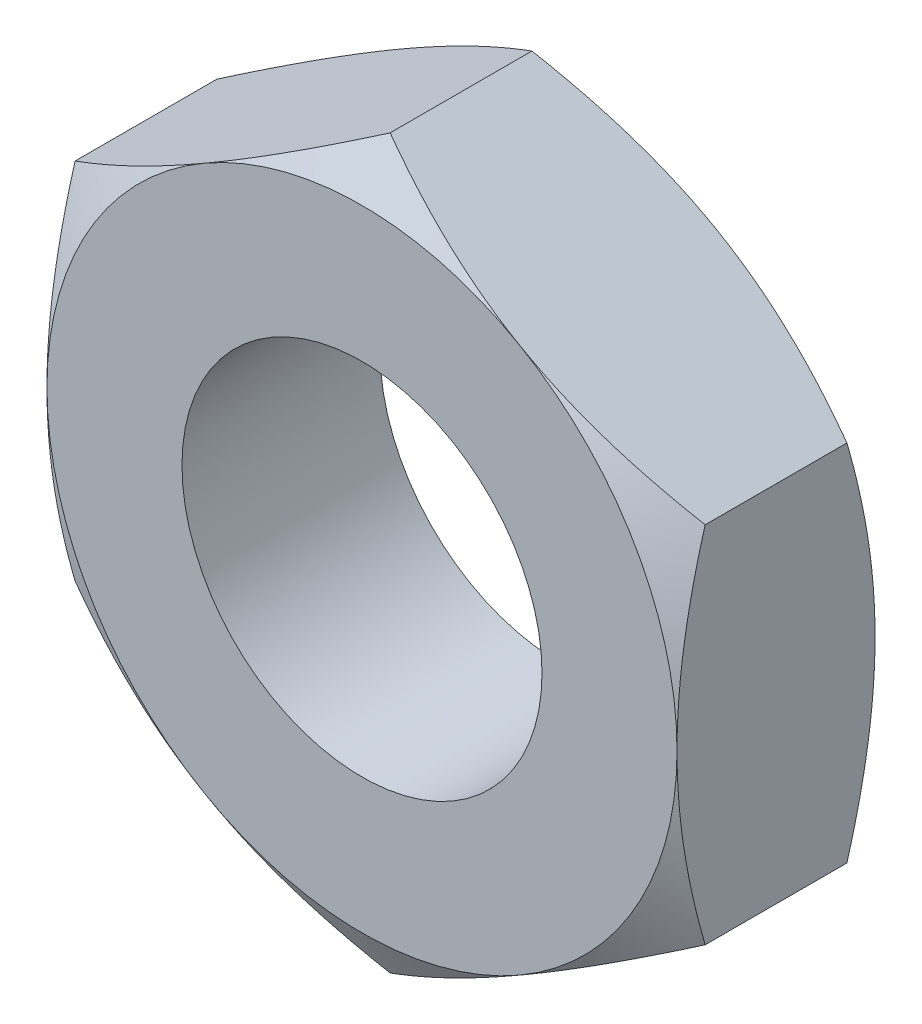
ISO-10303-21;
HEADER;
FILE_DESCRIPTION(('STEP AP214'),'2;1');
FILE_NAME('part.step','',(''),(''),'','','');
FILE_SCHEMA(('AUTOMOTIVE_DESIGN { 1 0 10303 214 1 1 1 1 }'));
ENDSEC;
DATA;
#1=APPLICATION_CONTEXT('core data for automotive mechanical design processes');
#2=APPLICATION_PROTOCOL_DEFINITION('international standard','automotive_design',2000,#1);
#3=PRODUCT_CONTEXT('',#1,'mechanical');
#4=PRODUCT('Part','Part','',(#3));
#5=PRODUCT_RELATED_PRODUCT_CATEGORY('part','',(#4));
#6=PRODUCT_DEFINITION_FORMATION('','',#4);
#7=PRODUCT_DEFINITION_CONTEXT('part definition',#1,'design');
#8=PRODUCT_DEFINITION('design','',#6,#7);
#9=PRODUCT_DEFINITION_SHAPE('','',#8);
#10=(LENGTH_UNIT() NAMED_UNIT(*) SI_UNIT(.MILLI.,.METRE.));
#11=(NAMED_UNIT(*) PLANE_ANGLE_UNIT() SI_UNIT($,.RADIAN.));
#12=(NAMED_UNIT(*) SI_UNIT($,.STERADIAN.) SOLID_ANGLE_UNIT());
#13=UNCERTAINTY_MEASURE_WITH_UNIT(LENGTH_MEASURE(1.E-05),#10,'distance_accuracy_value','');
#14=(GEOMETRIC_REPRESENTATION_CONTEXT(3) GLOBAL_UNCERTAINTY_ASSIGNED_CONTEXT((#13)) GLOBAL_UNIT_ASSIGNED_CONTEXT((#10,
#11,#12)) REPRESENTATION_CONTEXT('',''));
#15=CARTESIAN_POINT('',(0.,0.,0.));
#16=DIRECTION('',(0.,0.,1.));
#17=DIRECTION('',(1.,0.,0.));
#18=AXIS2_PLACEMENT_3D('',#15,#16,#17);
#19=CARTESIAN_POINT('',(0.,0.,-1.1));
#20=DIRECTION('',(0.,0.,1.));
#21=DIRECTION('',(1.,0.,0.));
#22=AXIS2_PLACEMENT_3D('',#19,#20,#21);
#23=PLANE('',#22);
#24=CARTESIAN_POINT('',(0.,0.,-1.1));
#25=DIRECTION('',(0.,0.,1.));
#26=DIRECTION('',(1.,0.,0.));
#27=AXIS2_PLACEMENT_3D('',#24,#25,#26);
#28=CIRCLE('',#27,2.);
#29=CARTESIAN_POINT('',(2.,0.,-1.1));
#30=VERTEX_POINT('',#29);
#31=EDGE_CURVE('E250',#30,#30,#28,.T.);
#32=ORIENTED_EDGE('',*,*,#31,.T.);
#33=EDGE_LOOP('',(#32));
#34=FACE_BOUND('',#33,.T.);
#35=CARTESIAN_POINT('',(0.,0.,-1.1));
#36=DIRECTION('',(0.,0.,1.));
#37=DIRECTION('',(1.,0.,0.));
#38=AXIS2_PLACEMENT_3D('',#35,#36,#37);
#39=CIRCLE('',#38,3.5);
#40=CARTESIAN_POINT('',(3.5,0.,-1.1));
#41=VERTEX_POINT('',#40);
#42=CARTESIAN_POINT('',(1.75,3.03108891324554,-1.1));
#43=VERTEX_POINT('',#42);
#44=EDGE_CURVE('E131',#41,#43,#39,.T.);
#45=ORIENTED_EDGE('',*,*,#44,.F.);
#46=CARTESIAN_POINT('',(0.,0.,-1.1));
#47=DIRECTION('',(0.,0.,1.));
#48=DIRECTION('',(1.,0.,0.));
#49=AXIS2_PLACEMENT_3D('',#46,#47,#48);
#50=CIRCLE('',#49,3.5);
#51=CARTESIAN_POINT('',(1.75,-3.03108891324553,-1.1));
#52=VERTEX_POINT('',#51);
#53=EDGE_CURVE('E12',#41,#52,#50,.F.);
#54=ORIENTED_EDGE('',*,*,#53,.T.);
#55=CARTESIAN_POINT('',(-1.75,-3.03108891324553,-1.1));
#56=VERTEX_POINT('',#55);
#57=EDGE_CURVE('E43',#52,#56,#50,.F.);
#58=ORIENTED_EDGE('',*,*,#57,.T.);
#59=CARTESIAN_POINT('',(-3.5,0.,-1.1));
#60=VERTEX_POINT('',#59);
#61=EDGE_CURVE('E309',#56,#60,#50,.F.);
#62=ORIENTED_EDGE('',*,*,#61,.T.);
#63=CARTESIAN_POINT('',(-1.75,3.03108891324553,-1.1));
#64=VERTEX_POINT('',#63);
#65=EDGE_CURVE('E143',#60,#64,#50,.F.);
#66=ORIENTED_EDGE('',*,*,#65,.T.);
#67=EDGE_CURVE('E44',#64,#43,#50,.F.);
#68=ORIENTED_EDGE('',*,*,#67,.T.);
#69=EDGE_LOOP('',(#45,#54,#58,#62,#66,#68));
#70=FACE_BOUND('',#69,.T.);
#71=ADVANCED_FACE('F34',(#34,#70),#23,.F.);
#72=CARTESIAN_POINT('',(0.,0.,1.1));
#73=DIRECTION('',(0.,0.,1.));
#74=DIRECTION('',(1.,0.,0.));
#75=AXIS2_PLACEMENT_3D('',#72,#73,#74);
#76=PLANE('',#75);
#77=CARTESIAN_POINT('',(0.,0.,1.1));
#78=DIRECTION('',(0.,0.,1.));
#79=DIRECTION('',(1.,0.,0.));
#80=AXIS2_PLACEMENT_3D('',#77,#78,#79);
#81=CIRCLE('',#80,2.);
#82=CARTESIAN_POINT('',(2.,0.,1.1));
#83=VERTEX_POINT('',#82);
#84=EDGE_CURVE('E246',#83,#83,#81,.T.);
#85=ORIENTED_EDGE('',*,*,#84,.F.);
#86=EDGE_LOOP('',(#85));
#87=FACE_BOUND('',#86,.T.);
#88=CARTESIAN_POINT('',(0.,0.,1.1));
#89=DIRECTION('',(0.,0.,1.));
#90=DIRECTION('',(1.,0.,0.));
#91=AXIS2_PLACEMENT_3D('',#88,#89,#90);
#92=CIRCLE('',#91,3.5);
#93=CARTESIAN_POINT('',(1.75,-3.03108891324553,1.1));
#94=VERTEX_POINT('',#93);
#95=CARTESIAN_POINT('',(3.5,0.,1.1));
#96=VERTEX_POINT('',#95);
#97=EDGE_CURVE('E291',#94,#96,#92,.T.);
#98=ORIENTED_EDGE('',*,*,#97,.T.);
#99=CARTESIAN_POINT('',(1.75,3.03108891324554,1.1));
#100=VERTEX_POINT('',#99);
#101=EDGE_CURVE('E280',#96,#100,#92,.T.);
#102=ORIENTED_EDGE('',*,*,#101,.T.);
#103=CARTESIAN_POINT('',(-1.75,3.03108891324553,1.1));
#104=VERTEX_POINT('',#103);
#105=EDGE_CURVE('E284',#100,#104,#92,.T.);
#106=ORIENTED_EDGE('',*,*,#105,.T.);
#107=CARTESIAN_POINT('',(-3.5,0.,1.1));
#108=VERTEX_POINT('',#107);
#109=EDGE_CURVE('E288',#104,#108,#92,.T.);
#110=ORIENTED_EDGE('',*,*,#109,.T.);
#111=CARTESIAN_POINT('',(-1.75,-3.03108891324554,1.1));
#112=VERTEX_POINT('',#111);
#113=EDGE_CURVE('E294',#108,#112,#92,.T.);
#114=ORIENTED_EDGE('',*,*,#113,.T.);
#115=EDGE_CURVE('E293',#112,#94,#92,.T.);
#116=ORIENTED_EDGE('',*,*,#115,.T.);
#117=EDGE_LOOP('',(#98,#102,#106,#110,#114,#116));
#118=FACE_BOUND('',#117,.T.);
#119=ADVANCED_FACE('F289',(#87,#118),#76,.T.);
#120=CARTESIAN_POINT('',(0.,4.04145188432738,1.1));
#121=DIRECTION('',(0.5,-0.866025403784438,0.));
#122=DIRECTION('',(0.866025403784439,0.5,0.));
#123=AXIS2_PLACEMENT_3D('',#120,#121,#122);
#124=PLANE('',#123);
#125=DIRECTION('',(0.,0.,-1.));
#126=VECTOR('',#125,1.);
#127=CARTESIAN_POINT('',(0.,4.04145188432738,1.1));
#128=LINE('',#127,#126);
#129=CARTESIAN_POINT('',(0.,4.04145188432738,0.787392608830358));
#130=VERTEX_POINT('',#129);
#131=CARTESIAN_POINT('',(0.,4.04145188432738,-0.787392608830359));
#132=VERTEX_POINT('',#131);
#133=EDGE_CURVE('E249',#130,#132,#128,.T.);
#134=ORIENTED_EDGE('',*,*,#133,.T.);
#135=CARTESIAN_POINT('',(0.000200000000002078,4.04156735438122,-0.787325939306631));
#136=CARTESIAN_POINT('',(-0.153607178452448,3.9527667384984,-0.838614211010018));
#137=CARTESIAN_POINT('',(-0.308742010834422,3.86319960126198,-0.885259046183804));
#138=CARTESIAN_POINT('',(-0.621698006576779,3.68251437287562,-0.966678124466652));
#139=CARTESIAN_POINT('',(-0.779524730787493,3.59139307116725,-1.00142356441544));
#140=CARTESIAN_POINT('',(-1.09322221038012,3.41027974688034,-1.05550997281717));
#141=CARTESIAN_POINT('',(-1.24904469916069,3.32031559103708,-1.07521091373962));
#142=CARTESIAN_POINT('',(-1.56142288720537,3.13996396008052,-1.09872986726275));
#143=CARTESIAN_POINT('',(-1.71797745103423,3.04957714051106,-1.10256735545444));
#144=CARTESIAN_POINT('',(-2.01050921992099,2.88068384499777,-1.09458469812302));
#145=CARTESIAN_POINT('',(-2.1465302124579,2.80215208834114,-1.08472456593039));
#146=CARTESIAN_POINT('',(-2.41768602028899,2.64560020969753,-1.0534735331006));
#147=CARTESIAN_POINT('',(-2.55281989768468,2.56758062920649,-1.0320719567142));
#148=CARTESIAN_POINT('',(-2.82453479240518,2.41070596159678,-0.978569592119425));
#149=CARTESIAN_POINT('',(-2.96108141927834,2.33187072981463,-0.946242005554915));
#150=CARTESIAN_POINT('',(-3.2321380929445,2.17537608630783,-0.872871066192007));
#151=CARTESIAN_POINT('',(-3.36665161246854,2.09771466960098,-0.831844953430135));
#152=CARTESIAN_POINT('',(-3.5002,2.02061047210985,-0.787325939306631));
#153=B_SPLINE_CURVE_WITH_KNOTS('',3,(#135,#136,#137,#138,#139,#140,#141,#142,#143,#144,#145,
#146,#147,#148,#149,#150,#151,#152),.UNSPECIFIED.,.F.,.F.,(4,2,2,2,2,2,2,2,4),(0.,
0.554793832886254,1.11092123814984,1.65328467083219,2.19498204478403,2.6666513085086,
3.13875761298267,3.6213361260051,4.10296698719188),.UNSPECIFIED.);
#154=EDGE_CURVE('E57',#132,#64,#153,.T.);
#155=ORIENTED_EDGE('',*,*,#154,.T.);
#156=CARTESIAN_POINT('',(-3.5,2.02072594216369,-0.787392608830358));
#157=VERTEX_POINT('',#156);
#158=EDGE_CURVE('E176',#64,#157,#153,.T.);
#159=ORIENTED_EDGE('',*,*,#158,.T.);
#160=DIRECTION('',(0.,0.,-1.));
#161=VECTOR('',#160,1.);
#162=CARTESIAN_POINT('',(-3.5,2.02072594216369,1.1));
#163=LINE('',#162,#161);
#164=CARTESIAN_POINT('',(-3.5,2.02072594216369,0.787392608830358));
#165=VERTEX_POINT('',#164);
#166=EDGE_CURVE('E264',#165,#157,#163,.T.);
#167=ORIENTED_EDGE('',*,*,#166,.F.);
#168=CARTESIAN_POINT('',(0.000200000000002078,4.04156735438122,0.787325939306631));
#169=CARTESIAN_POINT('',(-0.153607178452448,3.9527667384984,0.838614211010018));
#170=CARTESIAN_POINT('',(-0.308742010834422,3.86319960126198,0.885259046183804));
#171=CARTESIAN_POINT('',(-0.621698006576779,3.68251437287562,0.966678124466652));
#172=CARTESIAN_POINT('',(-0.779524730787493,3.59139307116725,1.00142356441544));
#173=CARTESIAN_POINT('',(-1.09322221038012,3.41027974688034,1.05550997281717));
#174=CARTESIAN_POINT('',(-1.24904469916069,3.32031559103708,1.07521091373962));
#175=CARTESIAN_POINT('',(-1.56142288720537,3.13996396008052,1.09872986726275));
#176=CARTESIAN_POINT('',(-1.71797745103423,3.04957714051106,1.10256735545444));
#177=CARTESIAN_POINT('',(-2.01050921992099,2.88068384499777,1.09458469812302));
#178=CARTESIAN_POINT('',(-2.1465302124579,2.80215208834114,1.08472456593039));
#179=CARTESIAN_POINT('',(-2.41768602028899,2.64560020969753,1.0534735331006));
#180=CARTESIAN_POINT('',(-2.55281989768468,2.56758062920649,1.0320719567142));
#181=CARTESIAN_POINT('',(-2.82453479240518,2.41070596159678,0.978569592119425));
#182=CARTESIAN_POINT('',(-2.96108141927834,2.33187072981463,0.946242005554915));
#183=CARTESIAN_POINT('',(-3.2321380929445,2.17537608630783,0.872871066192007));
#184=CARTESIAN_POINT('',(-3.36665161246854,2.09771466960098,0.831844953430135));
#185=CARTESIAN_POINT('',(-3.5002,2.02061047210985,0.787325939306631));
#186=B_SPLINE_CURVE_WITH_KNOTS('',3,(#168,#169,#170,#171,#172,#173,#174,#175,#176,#177,#178,
#179,#180,#181,#182,#183,#184,#185),.UNSPECIFIED.,.F.,.F.,(4,2,2,2,2,2,2,2,4),(0.,
0.554793832886254,1.11092123814984,1.65328467083219,2.19498204478403,2.6666513085086,
3.13875761298267,3.6213361260051,4.10296698719188),.UNSPECIFIED.);
#187=EDGE_CURVE('E239',#104,#165,#186,.T.);
#188=ORIENTED_EDGE('',*,*,#187,.F.);
#189=EDGE_CURVE('E245',#130,#104,#186,.T.);
#190=ORIENTED_EDGE('',*,*,#189,.F.);
#191=EDGE_LOOP('',(#134,#155,#159,#167,#188,#190));
#192=FACE_BOUND('',#191,.T.);
#193=ADVANCED_FACE('F36',(#192),#124,.F.);
#194=CARTESIAN_POINT('',(-3.5,2.02072594216369,1.1));
#195=DIRECTION('',(1.,0.,0.));
#196=DIRECTION('',(0.,0.,-1.));
#197=AXIS2_PLACEMENT_3D('',#194,#195,#196);
#198=PLANE('',#197);
#199=ORIENTED_EDGE('',*,*,#166,.T.);
#200=CARTESIAN_POINT('',(-3.5,6.62237498929366,1.20384920069994));
#201=CARTESIAN_POINT('',(-3.5,6.46698337506326,1.12454141631422));
#202=CARTESIAN_POINT('',(-3.5,6.31135185717237,1.04569935323296));
#203=CARTESIAN_POINT('',(-3.5,5.99950103907308,0.889178400037028));
#204=CARTESIAN_POINT('',(-3.5,5.84328172590165,0.811499535765534));
#205=CARTESIAN_POINT('',(-3.5,5.5298815671078,0.657406187731065));
#206=CARTESIAN_POINT('',(-3.5,5.37269952074963,0.580994141518542));
#207=CARTESIAN_POINT('',(-3.5,5.05750606530903,0.429891265605384));
#208=CARTESIAN_POINT('',(-3.5,4.89949464406857,0.355200461223919));
#209=CARTESIAN_POINT('',(-3.5,4.57449132742173,0.204239431299977));
#210=CARTESIAN_POINT('',(-3.5,4.40744814542194,0.128079290995464));
#211=CARTESIAN_POINT('',(-3.5,4.07203575670421,-0.0212598293516295));
#212=CARTESIAN_POINT('',(-3.5,3.90366658905408,-0.0944388968370185));
#213=CARTESIAN_POINT('',(-3.5,3.56542884332594,-0.236925943955217));
#214=CARTESIAN_POINT('',(-3.5,3.39556140883553,-0.30623662244884));
#215=CARTESIAN_POINT('',(-3.5,3.05383707796127,-0.439922098926701));
#216=CARTESIAN_POINT('',(-3.5,2.88197969950816,-0.504295670818577));
#217=CARTESIAN_POINT('',(-3.5,2.50410670294663,-0.637833379820852));
#218=CARTESIAN_POINT('',(-3.5,2.297624628782,-0.705699382529659));
#219=CARTESIAN_POINT('',(-3.5,1.88102985453117,-0.828978898262891));
#220=CARTESIAN_POINT('',(-3.5,1.67091915944462,-0.884399065240015));
#221=CARTESIAN_POINT('',(-3.5,1.25075240656588,-0.977701848207576));
#222=CARTESIAN_POINT('',(-3.5,1.04076681074656,-1.01588906183022));
#223=CARTESIAN_POINT('',(-3.5,0.723839080925787,-1.05809544723149));
#224=CARTESIAN_POINT('',(-3.5,0.61788035843607,-1.06965150772116));
#225=CARTESIAN_POINT('',(-3.5,0.4055193253992,-1.08738499992973));
#226=CARTESIAN_POINT('',(-3.5,0.299117080850263,-1.09356320507411));
#227=CARTESIAN_POINT('',(-3.5,0.0849448337999638,-1.10035848122527));
#228=CARTESIAN_POINT('',(-3.5,-0.0228271767806619,-1.1009126969313));
#229=CARTESIAN_POINT('',(-3.5,-0.238246571061905,-1.09627742939031));
#230=CARTESIAN_POINT('',(-3.5,-0.345893954242542,-1.09108792226466));
#231=CARTESIAN_POINT('',(-3.5,-0.560802179242902,-1.07515035334444));
#232=CARTESIAN_POINT('',(-3.5,-0.668062908780274,-1.06440079026023));
#233=CARTESIAN_POINT('',(-3.5,-0.881942140476983,-1.03770671567076));
#234=CARTESIAN_POINT('',(-3.5,-0.988560539769251,-1.02176139348268));
#235=CARTESIAN_POINT('',(-3.5,-1.31125051597137,-0.966139132186342));
#236=CARTESIAN_POINT('',(-3.5,-1.52605146710536,-0.919009608816308));
#237=CARTESIAN_POINT('',(-3.5,-1.95168495091537,-0.809695494576592));
#238=CARTESIAN_POINT('',(-3.5,-2.16251665140647,-0.747507783701123));
#239=CARTESIAN_POINT('',(-3.5,-2.56094887059657,-0.618466181316136));
#240=CARTESIAN_POINT('',(-3.5,-2.74887345130752,-0.55259716518923));
#241=CARTESIAN_POINT('',(-3.5,-3.12222177135753,-0.414079554638817));
#242=CARTESIAN_POINT('',(-3.5,-3.30764504196638,-0.341429709186368));
#243=CARTESIAN_POINT('',(-3.5,-3.67657256285478,-0.190985608211726));
#244=CARTESIAN_POINT('',(-3.5,-3.86007493353262,-0.113186776469622));
#245=CARTESIAN_POINT('',(-3.5,-4.22537274809097,0.0462649474191521));
#246=CARTESIAN_POINT('',(-3.5,-4.40716831978745,0.127917548166092));
#247=CARTESIAN_POINT('',(-3.5,-4.75995065416868,0.289860655115455));
#248=CARTESIAN_POINT('',(-3.5,-4.9310069133884,0.370000334369653));
#249=CARTESIAN_POINT('',(-3.5,-5.27211537161897,0.532396052430232));
#250=CARTESIAN_POINT('',(-3.5,-5.44216754365314,0.614652147782862));
#251=CARTESIAN_POINT('',(-3.5,-5.78097533377333,0.78062598575474));
#252=CARTESIAN_POINT('',(-3.5,-5.94973323172869,0.864339084844612));
#253=CARTESIAN_POINT('',(-3.5,-6.28654510508321,1.0331382707255));
#254=CARTESIAN_POINT('',(-3.5,-6.45459913401863,1.11822425061562));
#255=CARTESIAN_POINT('',(-3.5,-6.62237498929366,1.20384920069994));
#256=B_SPLINE_CURVE_WITH_KNOTS('',3,(#200,#201,#202,#203,#204,#205,#206,#207,#208,#209,#210,
#211,#212,#213,#214,#215,#216,#217,#218,#219,#220,#221,#222,#223,#224,#225,#226,#227,#228,#229,
#230,#231,#232,#233,#234,#235,#236,#237,#238,#239,#240,#241,#242,#243,#244,#245,#246,#247,#248,
#249,#250,#251,#252,#253,#254,#255),.UNSPECIFIED.,.F.,.F.,(4,2,2,2,2,2,2,2,2,2,2,2,2,2,2,2,2,2,
2,2,2,2,2,2,2,2,2,4),(0.,0.523382036157963,1.04677568326574,1.57108083596182,2.09539369617973,
2.64612852875721,3.19684719516559,3.74717671101212,4.29764245735546,4.949398757836,
5.60080577401626,6.24019874636632,6.55984296489709,6.87944120564918,7.20260748486242,
7.52577510759325,7.84903003550124,8.17233542433221,8.83125396706322,9.49030915249859,
10.0875436381509,10.6848885291939,11.2827716379512,11.8806096104473,12.4472873912146,
13.0139803281913,13.5791142859313,14.1442044492399),.UNSPECIFIED.);
#257=EDGE_CURVE('E297',#157,#60,#256,.T.);
#258=ORIENTED_EDGE('',*,*,#257,.T.);
#259=CARTESIAN_POINT('',(-3.5,-2.02072594216369,-0.787392608830357));
#260=VERTEX_POINT('',#259);
#261=EDGE_CURVE('E202',#60,#260,#256,.T.);
#262=ORIENTED_EDGE('',*,*,#261,.T.);
#263=DIRECTION('',(0.,0.,-1.));
#264=VECTOR('',#263,1.);
#265=CARTESIAN_POINT('',(-3.5,-2.02072594216369,1.1));
#266=LINE('',#265,#264);
#267=CARTESIAN_POINT('',(-3.5,-2.02072594216369,0.787392608830357));
#268=VERTEX_POINT('',#267);
#269=EDGE_CURVE('E261',#268,#260,#266,.T.);
#270=ORIENTED_EDGE('',*,*,#269,.F.);
#271=CARTESIAN_POINT('',(-3.5,6.62237498929366,-1.20384920069994));
#272=CARTESIAN_POINT('',(-3.5,6.46698337506326,-1.12454141631422));
#273=CARTESIAN_POINT('',(-3.5,6.31135185717237,-1.04569935323296));
#274=CARTESIAN_POINT('',(-3.5,5.99950103907308,-0.889178400037028));
#275=CARTESIAN_POINT('',(-3.5,5.84328172590165,-0.811499535765535));
#276=CARTESIAN_POINT('',(-3.5,5.5298815671078,-0.657406187731066));
#277=CARTESIAN_POINT('',(-3.5,5.37269952074963,-0.580994141518543));
#278=CARTESIAN_POINT('',(-3.5,5.05750606530903,-0.429891265605384));
#279=CARTESIAN_POINT('',(-3.5,4.89949464406857,-0.355200461223919));
#280=CARTESIAN_POINT('',(-3.5,4.57449132742173,-0.204239431299977));
#281=CARTESIAN_POINT('',(-3.5,4.40744814542195,-0.128079290995465));
#282=CARTESIAN_POINT('',(-3.5,4.07203575670421,0.021259829351629));
#283=CARTESIAN_POINT('',(-3.5,3.90366658905408,0.0944388968370181));
#284=CARTESIAN_POINT('',(-3.5,3.56542884332594,0.236925943955217));
#285=CARTESIAN_POINT('',(-3.5,3.39556140883553,0.30623662244884));
#286=CARTESIAN_POINT('',(-3.5,3.05383707796127,0.439922098926701));
#287=CARTESIAN_POINT('',(-3.5,2.88197969950816,0.504295670818577));
#288=CARTESIAN_POINT('',(-3.5,2.50410670294663,0.637833379820852));
#289=CARTESIAN_POINT('',(-3.5,2.297624628782,0.705699382529659));
#290=CARTESIAN_POINT('',(-3.5,1.88102985453117,0.828978898262891));
#291=CARTESIAN_POINT('',(-3.5,1.67091915944462,0.884399065240015));
#292=CARTESIAN_POINT('',(-3.5,1.25075240656588,0.977701848207575));
#293=CARTESIAN_POINT('',(-3.5,1.04076681074657,1.01588906183022));
#294=CARTESIAN_POINT('',(-3.5,0.72383908092579,1.05809544723149));
#295=CARTESIAN_POINT('',(-3.5,0.617880358436072,1.06965150772116));
#296=CARTESIAN_POINT('',(-3.5,0.405519325399202,1.08738499992973));
#297=CARTESIAN_POINT('',(-3.5,0.299117080850265,1.09356320507411));
#298=CARTESIAN_POINT('',(-3.5,0.0849448337999658,1.10035848122527));
#299=CARTESIAN_POINT('',(-3.5,-0.0228271767806601,1.1009126969313));
#300=CARTESIAN_POINT('',(-3.5,-0.238246571061904,1.09627742939031));
#301=CARTESIAN_POINT('',(-3.5,-0.345893954242541,1.09108792226466));
#302=CARTESIAN_POINT('',(-3.5,-0.560802179242901,1.07515035334444));
#303=CARTESIAN_POINT('',(-3.5,-0.668062908780272,1.06440079026023));
#304=CARTESIAN_POINT('',(-3.5,-0.881942140476982,1.03770671567076));
#305=CARTESIAN_POINT('',(-3.5,-0.98856053976925,1.02176139348268));
#306=CARTESIAN_POINT('',(-3.5,-1.31125051597137,0.966139132186342));
#307=CARTESIAN_POINT('',(-3.5,-1.52605146710536,0.919009608816308));
#308=CARTESIAN_POINT('',(-3.5,-1.95168495091536,0.809695494576593));
#309=CARTESIAN_POINT('',(-3.5,-2.16251665140647,0.747507783701123));
#310=CARTESIAN_POINT('',(-3.5,-2.56094887059657,0.618466181316137));
#311=CARTESIAN_POINT('',(-3.5,-2.74887345130752,0.55259716518923));
#312=CARTESIAN_POINT('',(-3.5,-3.12222177135753,0.414079554638817));
#313=CARTESIAN_POINT('',(-3.5,-3.30764504196638,0.341429709186368));
#314=CARTESIAN_POINT('',(-3.5,-3.67657256285478,0.190985608211727));
#315=CARTESIAN_POINT('',(-3.5,-3.86007493353262,0.113186776469622));
#316=CARTESIAN_POINT('',(-3.5,-4.22537274809097,-0.0462649474191521));
#317=CARTESIAN_POINT('',(-3.5,-4.40716831978745,-0.127917548166092));
#318=CARTESIAN_POINT('',(-3.5,-4.75995065416868,-0.289860655115455));
#319=CARTESIAN_POINT('',(-3.5,-4.9310069133884,-0.370000334369654));
#320=CARTESIAN_POINT('',(-3.5,-5.27211537161897,-0.532396052430233));
#321=CARTESIAN_POINT('',(-3.5,-5.44216754365314,-0.614652147782862));
#322=CARTESIAN_POINT('',(-3.5,-5.78097533377333,-0.780625985754741));
#323=CARTESIAN_POINT('',(-3.5,-5.94973323172869,-0.864339084844613));
#324=CARTESIAN_POINT('',(-3.5,-6.28654510508321,-1.0331382707255));
#325=CARTESIAN_POINT('',(-3.5,-6.45459913401863,-1.11822425061563));
#326=CARTESIAN_POINT('',(-3.5,-6.62237498929366,-1.20384920069994));
#327=B_SPLINE_CURVE_WITH_KNOTS('',3,(#271,#272,#273,#274,#275,#276,#277,#278,#279,#280,#281,
#282,#283,#284,#285,#286,#287,#288,#289,#290,#291,#292,#293,#294,#295,#296,#297,#298,#299,#300,
#301,#302,#303,#304,#305,#306,#307,#308,#309,#310,#311,#312,#313,#314,#315,#316,#317,#318,#319,
#320,#321,#322,#323,#324,#325,#326),.UNSPECIFIED.,.F.,.F.,(4,2,2,2,2,2,2,2,2,2,2,2,2,2,2,2,2,2,
2,2,2,2,2,2,2,2,2,4),(0.,0.523382036157963,1.04677568326574,1.57108083596182,2.09539369617973,
2.64612852875721,3.19684719516559,3.74717671101212,4.29764245735546,4.949398757836,
5.60080577401626,6.24019874636632,6.55984296489708,6.87944120564917,7.20260748486242,
7.52577510759325,7.84903003550124,8.17233542433221,8.83125396706322,9.49030915249859,
10.0875436381509,10.6848885291939,11.2827716379512,11.8806096104473,12.4472873912146,
13.0139803281913,13.5791142859313,14.1442044492399),.UNSPECIFIED.);
#328=EDGE_CURVE('E232',#108,#268,#327,.T.);
#329=ORIENTED_EDGE('',*,*,#328,.F.);
#330=EDGE_CURVE('E238',#165,#108,#327,.T.);
#331=ORIENTED_EDGE('',*,*,#330,.F.);
#332=EDGE_LOOP('',(#199,#258,#262,#270,#329,#331));
#333=FACE_BOUND('',#332,.T.);
#334=ADVANCED_FACE('F211',(#333),#198,.F.);
#335=CARTESIAN_POINT('',(-3.5,-2.02072594216369,1.1));
#336=DIRECTION('',(0.5,0.866025403784438,0.));
#337=DIRECTION('',(-0.866025403784439,0.5,0.));
#338=AXIS2_PLACEMENT_3D('',#335,#336,#337);
#339=PLANE('',#338);
#340=ORIENTED_EDGE('',*,*,#269,.T.);
#341=CARTESIAN_POINT('',(-3.5002,-2.02061047210985,-0.787325939306629));
#342=CARTESIAN_POINT('',(-3.34639282154755,-2.10941108799267,-0.838614211010017));
#343=CARTESIAN_POINT('',(-3.19125798916558,-2.19897822522909,-0.885259046183803));
#344=CARTESIAN_POINT('',(-2.87830199342322,-2.37966345361545,-0.966678124466651));
#345=CARTESIAN_POINT('',(-2.72047526921251,-2.47078475532382,-1.00142356441544));
#346=CARTESIAN_POINT('',(-2.40677778961987,-2.65189807961074,-1.05550997281716));
#347=CARTESIAN_POINT('',(-2.25095530083931,-2.74186223545399,-1.07521091373962));
#348=CARTESIAN_POINT('',(-1.93857711279463,-2.92221386641056,-1.09872986726274));
#349=CARTESIAN_POINT('',(-1.78202254896577,-3.01260068598001,-1.10256735545443));
#350=CARTESIAN_POINT('',(-1.48949078007901,-3.1814939814933,-1.09458469812302));
#351=CARTESIAN_POINT('',(-1.3534697875421,-3.26002573814993,-1.08472456593039));
#352=CARTESIAN_POINT('',(-1.08231397971101,-3.41657761679354,-1.0534735331006));
#353=CARTESIAN_POINT('',(-0.947180102315319,-3.49459719728458,-1.0320719567142));
#354=CARTESIAN_POINT('',(-0.675465207594818,-3.65147186489429,-0.978569592119422));
#355=CARTESIAN_POINT('',(-0.538918580721667,-3.73030709667644,-0.946242005554913));
#356=CARTESIAN_POINT('',(-0.2678619070555,-3.88680174018324,-0.872871066192006));
#357=CARTESIAN_POINT('',(-0.133348387531465,-3.96446315689009,-0.831844953430134));
#358=CARTESIAN_POINT('',(0.000199999999997778,-4.04156735438122,-0.78732593930663));
#359=B_SPLINE_CURVE_WITH_KNOTS('',3,(#341,#342,#343,#344,#345,#346,#347,#348,#349,#350,#351,
#352,#353,#354,#355,#356,#357,#358),.UNSPECIFIED.,.F.,.F.,(4,2,2,2,2,2,2,2,4),(0.,
0.554793832886254,1.11092123814984,1.65328467083219,2.19498204478403,2.6666513085086,
3.13875761298267,3.6213361260051,4.10296698719187),.UNSPECIFIED.);
#360=EDGE_CURVE('E200',#260,#56,#359,.T.);
#361=ORIENTED_EDGE('',*,*,#360,.T.);
#362=CARTESIAN_POINT('',(0.,-4.04145188432738,-0.787392608830357));
#363=VERTEX_POINT('',#362);
#364=EDGE_CURVE('E193',#56,#363,#359,.T.);
#365=ORIENTED_EDGE('',*,*,#364,.T.);
#366=DIRECTION('',(0.,0.,-1.));
#367=VECTOR('',#366,1.);
#368=CARTESIAN_POINT('',(0.,-4.04145188432738,1.1));
#369=LINE('',#368,#367);
#370=CARTESIAN_POINT('',(0.,-4.04145188432738,0.787392608830357));
#371=VERTEX_POINT('',#370);
#372=EDGE_CURVE('E258',#371,#363,#369,.T.);
#373=ORIENTED_EDGE('',*,*,#372,.F.);
#374=CARTESIAN_POINT('',(-3.5002,-2.02061047210985,0.787325939306629));
#375=CARTESIAN_POINT('',(-3.34639282154755,-2.10941108799267,0.838614211010017));
#376=CARTESIAN_POINT('',(-3.19125798916558,-2.19897822522909,0.885259046183803));
#377=CARTESIAN_POINT('',(-2.87830199342322,-2.37966345361545,0.966678124466651));
#378=CARTESIAN_POINT('',(-2.72047526921251,-2.47078475532382,1.00142356441544));
#379=CARTESIAN_POINT('',(-2.40677778961987,-2.65189807961074,1.05550997281716));
#380=CARTESIAN_POINT('',(-2.25095530083931,-2.74186223545399,1.07521091373962));
#381=CARTESIAN_POINT('',(-1.93857711279463,-2.92221386641056,1.09872986726274));
#382=CARTESIAN_POINT('',(-1.78202254896577,-3.01260068598001,1.10256735545443));
#383=CARTESIAN_POINT('',(-1.48949078007901,-3.1814939814933,1.09458469812302));
#384=CARTESIAN_POINT('',(-1.3534697875421,-3.26002573814993,1.08472456593039));
#385=CARTESIAN_POINT('',(-1.08231397971101,-3.41657761679354,1.0534735331006));
#386=CARTESIAN_POINT('',(-0.947180102315319,-3.49459719728458,1.0320719567142));
#387=CARTESIAN_POINT('',(-0.675465207594818,-3.65147186489429,0.978569592119422));
#388=CARTESIAN_POINT('',(-0.538918580721667,-3.73030709667644,0.946242005554913));
#389=CARTESIAN_POINT('',(-0.2678619070555,-3.88680174018324,0.872871066192006));
#390=CARTESIAN_POINT('',(-0.133348387531465,-3.96446315689009,0.831844953430134));
#391=CARTESIAN_POINT('',(0.000199999999997778,-4.04156735438122,0.78732593930663));
#392=B_SPLINE_CURVE_WITH_KNOTS('',3,(#374,#375,#376,#377,#378,#379,#380,#381,#382,#383,#384,
#385,#386,#387,#388,#389,#390,#391),.UNSPECIFIED.,.F.,.F.,(4,2,2,2,2,2,2,2,4),(0.,
0.554793832886254,1.11092123814984,1.65328467083219,2.19498204478403,2.6666513085086,
3.13875761298267,3.6213361260051,4.10296698719187),.UNSPECIFIED.);
#393=EDGE_CURVE('E217',#112,#371,#392,.T.);
#394=ORIENTED_EDGE('',*,*,#393,.F.);
#395=EDGE_CURVE('E224',#268,#112,#392,.T.);
#396=ORIENTED_EDGE('',*,*,#395,.F.);
#397=EDGE_LOOP('',(#340,#361,#365,#373,#394,#396));
#398=FACE_BOUND('',#397,.T.);
#399=ADVANCED_FACE('F207',(#398),#339,.F.);
#400=CARTESIAN_POINT('',(0.,-4.04145188432738,1.1));
#401=DIRECTION('',(-0.5,0.866025403784438,0.));
#402=DIRECTION('',(-0.866025403784438,-0.5,0.));
#403=AXIS2_PLACEMENT_3D('',#400,#401,#402);
#404=PLANE('',#403);
#405=ORIENTED_EDGE('',*,*,#372,.T.);
#406=CARTESIAN_POINT('',(-0.000200000000001753,-4.04156735438122,-0.787325939306629));
#407=CARTESIAN_POINT('',(0.153607178452448,-3.9527667384984,-0.838614211010017));
#408=CARTESIAN_POINT('',(0.308742010834422,-3.86319960126198,-0.885259046183803));
#409=CARTESIAN_POINT('',(0.62169800657678,-3.68251437287562,-0.966678124466652));
#410=CARTESIAN_POINT('',(0.779524730787494,-3.59139307116725,-1.00142356441544));
#411=CARTESIAN_POINT('',(1.09322221038013,-3.41027974688034,-1.05550997281716));
#412=CARTESIAN_POINT('',(1.24904469916069,-3.32031559103708,-1.07521091373962));
#413=CARTESIAN_POINT('',(1.56142288720537,-3.13996396008052,-1.09872986726275));
#414=CARTESIAN_POINT('',(1.71797745103423,-3.04957714051106,-1.10256735545444));
#415=CARTESIAN_POINT('',(2.01050921992099,-2.88068384499777,-1.09458469812302));
#416=CARTESIAN_POINT('',(2.1465302124579,-2.80215208834114,-1.08472456593039));
#417=CARTESIAN_POINT('',(2.41768602028899,-2.64560020969753,-1.0534735331006));
#418=CARTESIAN_POINT('',(2.55281989768468,-2.5675806292065,-1.0320719567142));
#419=CARTESIAN_POINT('',(2.82453479240518,-2.41070596159678,-0.978569592119424));
#420=CARTESIAN_POINT('',(2.96108141927833,-2.33187072981463,-0.946242005554915));
#421=CARTESIAN_POINT('',(3.2321380929445,-2.17537608630783,-0.872871066192008));
#422=CARTESIAN_POINT('',(3.36665161246853,-2.09771466960098,-0.831844953430135));
#423=CARTESIAN_POINT('',(3.5002,-2.02061047210985,-0.787325939306632));
#424=B_SPLINE_CURVE_WITH_KNOTS('',3,(#406,#407,#408,#409,#410,#411,#412,#413,#414,#415,#416,
#417,#418,#419,#420,#421,#422,#423),.UNSPECIFIED.,.F.,.F.,(4,2,2,2,2,2,2,2,4),(0.,
0.554793832886254,1.11092123814984,1.65328467083219,2.19498204478403,2.6666513085086,
3.13875761298267,3.6213361260051,4.10296698719187),.UNSPECIFIED.);
#425=EDGE_CURVE('E201',#363,#52,#424,.T.);
#426=ORIENTED_EDGE('',*,*,#425,.T.);
#427=CARTESIAN_POINT('',(3.5,-2.02072594216369,-0.787392608830359));
#428=VERTEX_POINT('',#427);
#429=EDGE_CURVE('E186',#52,#428,#424,.T.);
#430=ORIENTED_EDGE('',*,*,#429,.T.);
#431=DIRECTION('',(0.,0.,-1.));
#432=VECTOR('',#431,1.);
#433=CARTESIAN_POINT('',(3.5,-2.02072594216369,1.1));
#434=LINE('',#433,#432);
#435=CARTESIAN_POINT('',(3.5,-2.02072594216369,0.787392608830359));
#436=VERTEX_POINT('',#435);
#437=EDGE_CURVE('E255',#436,#428,#434,.T.);
#438=ORIENTED_EDGE('',*,*,#437,.F.);
#439=CARTESIAN_POINT('',(-0.000200000000001753,-4.04156735438122,0.787325939306629));
#440=CARTESIAN_POINT('',(0.153607178452448,-3.9527667384984,0.838614211010017));
#441=CARTESIAN_POINT('',(0.308742010834422,-3.86319960126198,0.885259046183803));
#442=CARTESIAN_POINT('',(0.62169800657678,-3.68251437287562,0.966678124466652));
#443=CARTESIAN_POINT('',(0.779524730787494,-3.59139307116725,1.00142356441544));
#444=CARTESIAN_POINT('',(1.09322221038013,-3.41027974688034,1.05550997281716));
#445=CARTESIAN_POINT('',(1.24904469916069,-3.32031559103708,1.07521091373962));
#446=CARTESIAN_POINT('',(1.56142288720537,-3.13996396008052,1.09872986726275));
#447=CARTESIAN_POINT('',(1.71797745103423,-3.04957714051106,1.10256735545444));
#448=CARTESIAN_POINT('',(2.01050921992099,-2.88068384499777,1.09458469812302));
#449=CARTESIAN_POINT('',(2.1465302124579,-2.80215208834114,1.08472456593039));
#450=CARTESIAN_POINT('',(2.41768602028899,-2.64560020969753,1.0534735331006));
#451=CARTESIAN_POINT('',(2.55281989768468,-2.5675806292065,1.0320719567142));
#452=CARTESIAN_POINT('',(2.82453479240518,-2.41070596159678,0.978569592119424));
#453=CARTESIAN_POINT('',(2.96108141927833,-2.33187072981463,0.946242005554915));
#454=CARTESIAN_POINT('',(3.2321380929445,-2.17537608630783,0.872871066192008));
#455=CARTESIAN_POINT('',(3.36665161246853,-2.09771466960098,0.831844953430135));
#456=CARTESIAN_POINT('',(3.5002,-2.02061047210985,0.787325939306632));
#457=B_SPLINE_CURVE_WITH_KNOTS('',3,(#439,#440,#441,#442,#443,#444,#445,#446,#447,#448,#449,
#450,#451,#452,#453,#454,#455,#456),.UNSPECIFIED.,.F.,.F.,(4,2,2,2,2,2,2,2,4),(0.,
0.554793832886254,1.11092123814984,1.65328467083219,2.19498204478403,2.6666513085086,
3.13875761298267,3.6213361260051,4.10296698719187),.UNSPECIFIED.);
#458=EDGE_CURVE('E226',#94,#436,#457,.T.);
#459=ORIENTED_EDGE('',*,*,#458,.F.);
#460=EDGE_CURVE('E225',#371,#94,#457,.T.);
#461=ORIENTED_EDGE('',*,*,#460,.F.);
#462=EDGE_LOOP('',(#405,#426,#430,#438,#459,#461));
#463=FACE_BOUND('',#462,.T.);
#464=ADVANCED_FACE('F210',(#463),#404,.F.);
#465=CARTESIAN_POINT('',(3.5,-2.02072594216369,1.1));
#466=DIRECTION('',(-1.,0.,0.));
#467=DIRECTION('',(0.,0.,1.));
#468=AXIS2_PLACEMENT_3D('',#465,#466,#467);
#469=PLANE('',#468);
#470=ORIENTED_EDGE('',*,*,#437,.T.);
#471=CARTESIAN_POINT('',(3.5,-6.62237498929366,1.20384920069994));
#472=CARTESIAN_POINT('',(3.5,-6.46698337506326,1.12454141631423));
#473=CARTESIAN_POINT('',(3.5,-6.31135185717237,1.04569935323296));
#474=CARTESIAN_POINT('',(3.5,-5.99950103907309,0.88917840003703));
#475=CARTESIAN_POINT('',(3.5,-5.84328172590166,0.811499535765537));
#476=CARTESIAN_POINT('',(3.5,-5.52988156710781,0.657406187731068));
#477=CARTESIAN_POINT('',(3.5,-5.37269952074963,0.580994141518544));
#478=CARTESIAN_POINT('',(3.5,-5.05750606530904,0.429891265605385));
#479=CARTESIAN_POINT('',(3.5,-4.89949464406858,0.355200461223921));
#480=CARTESIAN_POINT('',(3.5,-4.57449132742174,0.204239431299978));
#481=CARTESIAN_POINT('',(3.5,-4.40744814542195,0.128079290995466));
#482=CARTESIAN_POINT('',(3.5,-4.07203575670422,-0.0212598293516277));
#483=CARTESIAN_POINT('',(3.5,-3.90366658905408,-0.0944388968370169));
#484=CARTESIAN_POINT('',(3.5,-3.56542884332594,-0.236925943955216));
#485=CARTESIAN_POINT('',(3.5,-3.39556140883554,-0.30623662244884));
#486=CARTESIAN_POINT('',(3.5,-3.05383707796128,-0.439922098926701));
#487=CARTESIAN_POINT('',(3.5,-2.88197969950816,-0.504295670818577));
#488=CARTESIAN_POINT('',(3.5,-2.50410670294663,-0.637833379820853));
#489=CARTESIAN_POINT('',(3.5,-2.297624628782,-0.70569938252966));
#490=CARTESIAN_POINT('',(3.5,-1.88102985453118,-0.828978898262892));
#491=CARTESIAN_POINT('',(3.5,-1.67091915944463,-0.884399065240016));
#492=CARTESIAN_POINT('',(3.5,-1.25075240656588,-0.977701848207577));
#493=CARTESIAN_POINT('',(3.5,-1.04076681074657,-1.01588906183022));
#494=CARTESIAN_POINT('',(3.5,-0.723839080925794,-1.05809544723149));
#495=CARTESIAN_POINT('',(3.5,-0.617880358436076,-1.06965150772116));
#496=CARTESIAN_POINT('',(3.5,-0.405519325399206,-1.08738499992973));
#497=CARTESIAN_POINT('',(3.5,-0.299117080850269,-1.09356320507411));
#498=CARTESIAN_POINT('',(3.5,-0.0849448337999705,-1.10035848122527));
#499=CARTESIAN_POINT('',(3.5,0.0228271767806553,-1.1009126969313));
#500=CARTESIAN_POINT('',(3.5,0.238246571061899,-1.09627742939031));
#501=CARTESIAN_POINT('',(3.5,0.345893954242535,-1.09108792226467));
#502=CARTESIAN_POINT('',(3.5,0.560802179242895,-1.07515035334444));
#503=CARTESIAN_POINT('',(3.5,0.668062908780267,-1.06440079026023));
#504=CARTESIAN_POINT('',(3.5,0.881942140476977,-1.03770671567076));
#505=CARTESIAN_POINT('',(3.5,0.988560539769244,-1.02176139348269));
#506=CARTESIAN_POINT('',(3.5,1.31125051597136,-0.966139132186346));
#507=CARTESIAN_POINT('',(3.5,1.52605146710535,-0.919009608816312));
#508=CARTESIAN_POINT('',(3.5,1.95168495091536,-0.809695494576596));
#509=CARTESIAN_POINT('',(3.5,2.16251665140646,-0.747507783701126));
#510=CARTESIAN_POINT('',(3.5,2.56094887059656,-0.618466181316139));
#511=CARTESIAN_POINT('',(3.5,2.74887345130751,-0.552597165189233));
#512=CARTESIAN_POINT('',(3.5,3.12222177135752,-0.41407955463882));
#513=CARTESIAN_POINT('',(3.5,3.30764504196637,-0.34142970918637));
#514=CARTESIAN_POINT('',(3.5,3.67657256285478,-0.190985608211728));
#515=CARTESIAN_POINT('',(3.5,3.86007493353262,-0.113186776469623));
#516=CARTESIAN_POINT('',(3.5,4.22537274809097,0.0462649474191514));
#517=CARTESIAN_POINT('',(3.5,4.40716831978745,0.127917548166091));
#518=CARTESIAN_POINT('',(3.5,4.75995065416868,0.289860655115455));
#519=CARTESIAN_POINT('',(3.5,4.9310069133884,0.370000334369654));
#520=CARTESIAN_POINT('',(3.5,5.27211537161898,0.532396052430233));
#521=CARTESIAN_POINT('',(3.5,5.44216754365315,0.614652147782863));
#522=CARTESIAN_POINT('',(3.5,5.78097533377333,0.780625985754741));
#523=CARTESIAN_POINT('',(3.5,5.9497332317287,0.864339084844614));
#524=CARTESIAN_POINT('',(3.5,6.28654510508322,1.0331382707255));
#525=CARTESIAN_POINT('',(3.5,6.45459913401863,1.11822425061563));
#526=CARTESIAN_POINT('',(3.5,6.62237498929367,1.20384920069994));
#527=B_SPLINE_CURVE_WITH_KNOTS('',3,(#471,#472,#473,#474,#475,#476,#477,#478,#479,#480,#481,
#482,#483,#484,#485,#486,#487,#488,#489,#490,#491,#492,#493,#494,#495,#496,#497,#498,#499,#500,
#501,#502,#503,#504,#505,#506,#507,#508,#509,#510,#511,#512,#513,#514,#515,#516,#517,#518,#519,
#520,#521,#522,#523,#524,#525,#526),.UNSPECIFIED.,.F.,.F.,(4,2,2,2,2,2,2,2,2,2,2,2,2,2,2,2,2,2,
2,2,2,2,2,2,2,2,2,4),(0.,0.523382036157963,1.04677568326574,1.57108083596182,2.09539369617973,
2.64612852875721,3.19684719516559,3.74717671101212,4.29764245735546,4.94939875783601,
5.60080577401626,6.24019874636632,6.55984296489709,6.87944120564918,7.20260748486242,
7.52577510759325,7.84903003550125,8.17233542433221,8.83125396706323,9.49030915249859,
10.0875436381509,10.6848885291939,11.2827716379513,11.8806096104473,12.4472873912146,
13.0139803281913,13.5791142859313,14.1442044492399),.UNSPECIFIED.);
#528=EDGE_CURVE('E150',#428,#41,#527,.T.);
#529=ORIENTED_EDGE('',*,*,#528,.T.);
#530=CARTESIAN_POINT('',(3.5,2.02072594216369,-0.787392608830359));
#531=VERTEX_POINT('',#530);
#532=EDGE_CURVE('E137',#41,#531,#527,.T.);
#533=ORIENTED_EDGE('',*,*,#532,.T.);
#534=DIRECTION('',(0.,0.,-1.));
#535=VECTOR('',#534,1.);
#536=CARTESIAN_POINT('',(3.5,2.02072594216369,1.1));
#537=LINE('',#536,#535);
#538=CARTESIAN_POINT('',(3.5,2.02072594216369,0.787392608830359));
#539=VERTEX_POINT('',#538);
#540=EDGE_CURVE('E149',#539,#531,#537,.T.);
#541=ORIENTED_EDGE('',*,*,#540,.F.);
#542=CARTESIAN_POINT('',(3.5,-6.62237498929366,-1.20384920069994));
#543=CARTESIAN_POINT('',(3.5,-6.46698337506326,-1.12454141631423));
#544=CARTESIAN_POINT('',(3.5,-6.31135185717237,-1.04569935323296));
#545=CARTESIAN_POINT('',(3.5,-5.99950103907309,-0.88917840003703));
#546=CARTESIAN_POINT('',(3.5,-5.84328172590166,-0.811499535765537));
#547=CARTESIAN_POINT('',(3.5,-5.52988156710781,-0.657406187731068));
#548=CARTESIAN_POINT('',(3.5,-5.37269952074963,-0.580994141518544));
#549=CARTESIAN_POINT('',(3.5,-5.05750606530904,-0.429891265605385));
#550=CARTESIAN_POINT('',(3.5,-4.89949464406858,-0.355200461223921));
#551=CARTESIAN_POINT('',(3.5,-4.57449132742174,-0.204239431299978));
#552=CARTESIAN_POINT('',(3.5,-4.40744814542195,-0.128079290995466));
#553=CARTESIAN_POINT('',(3.5,-4.07203575670422,0.0212598293516277));
#554=CARTESIAN_POINT('',(3.5,-3.90366658905408,0.0944388968370169));
#555=CARTESIAN_POINT('',(3.5,-3.56542884332594,0.236925943955216));
#556=CARTESIAN_POINT('',(3.5,-3.39556140883554,0.30623662244884));
#557=CARTESIAN_POINT('',(3.5,-3.05383707796128,0.439922098926701));
#558=CARTESIAN_POINT('',(3.5,-2.88197969950816,0.504295670818577));
#559=CARTESIAN_POINT('',(3.5,-2.50410670294663,0.637833379820853));
#560=CARTESIAN_POINT('',(3.5,-2.297624628782,0.70569938252966));
#561=CARTESIAN_POINT('',(3.5,-1.88102985453118,0.828978898262892));
#562=CARTESIAN_POINT('',(3.5,-1.67091915944463,0.884399065240016));
#563=CARTESIAN_POINT('',(3.5,-1.25075240656588,0.977701848207577));
#564=CARTESIAN_POINT('',(3.5,-1.04076681074657,1.01588906183022));
#565=CARTESIAN_POINT('',(3.5,-0.723839080925794,1.05809544723149));
#566=CARTESIAN_POINT('',(3.5,-0.617880358436076,1.06965150772116));
#567=CARTESIAN_POINT('',(3.5,-0.405519325399206,1.08738499992973));
#568=CARTESIAN_POINT('',(3.5,-0.299117080850269,1.09356320507411));
#569=CARTESIAN_POINT('',(3.5,-0.0849448337999705,1.10035848122527));
#570=CARTESIAN_POINT('',(3.5,0.0228271767806553,1.1009126969313));
#571=CARTESIAN_POINT('',(3.5,0.238246571061899,1.09627742939031));
#572=CARTESIAN_POINT('',(3.5,0.345893954242535,1.09108792226467));
#573=CARTESIAN_POINT('',(3.5,0.560802179242895,1.07515035334444));
#574=CARTESIAN_POINT('',(3.5,0.668062908780267,1.06440079026023));
#575=CARTESIAN_POINT('',(3.5,0.881942140476977,1.03770671567076));
#576=CARTESIAN_POINT('',(3.5,0.988560539769244,1.02176139348269));
#577=CARTESIAN_POINT('',(3.5,1.31125051597136,0.966139132186346));
#578=CARTESIAN_POINT('',(3.5,1.52605146710535,0.919009608816312));
#579=CARTESIAN_POINT('',(3.5,1.95168495091536,0.809695494576596));
#580=CARTESIAN_POINT('',(3.5,2.16251665140646,0.747507783701126));
#581=CARTESIAN_POINT('',(3.5,2.56094887059656,0.618466181316139));
#582=CARTESIAN_POINT('',(3.5,2.74887345130751,0.552597165189233));
#583=CARTESIAN_POINT('',(3.5,3.12222177135752,0.41407955463882));
#584=CARTESIAN_POINT('',(3.5,3.30764504196637,0.34142970918637));
#585=CARTESIAN_POINT('',(3.5,3.67657256285478,0.190985608211728));
#586=CARTESIAN_POINT('',(3.5,3.86007493353262,0.113186776469623));
#587=CARTESIAN_POINT('',(3.5,4.22537274809097,-0.0462649474191514));
#588=CARTESIAN_POINT('',(3.5,4.40716831978745,-0.127917548166091));
#589=CARTESIAN_POINT('',(3.5,4.75995065416868,-0.289860655115455));
#590=CARTESIAN_POINT('',(3.5,4.9310069133884,-0.370000334369654));
#591=CARTESIAN_POINT('',(3.5,5.27211537161898,-0.532396052430233));
#592=CARTESIAN_POINT('',(3.5,5.44216754365315,-0.614652147782863));
#593=CARTESIAN_POINT('',(3.5,5.78097533377333,-0.780625985754741));
#594=CARTESIAN_POINT('',(3.5,5.9497332317287,-0.864339084844614));
#595=CARTESIAN_POINT('',(3.5,6.28654510508322,-1.0331382707255));
#596=CARTESIAN_POINT('',(3.5,6.45459913401863,-1.11822425061563));
#597=CARTESIAN_POINT('',(3.5,6.62237498929367,-1.20384920069994));
#598=B_SPLINE_CURVE_WITH_KNOTS('',3,(#542,#543,#544,#545,#546,#547,#548,#549,#550,#551,#552,
#553,#554,#555,#556,#557,#558,#559,#560,#561,#562,#563,#564,#565,#566,#567,#568,#569,#570,#571,
#572,#573,#574,#575,#576,#577,#578,#579,#580,#581,#582,#583,#584,#585,#586,#587,#588,#589,#590,
#591,#592,#593,#594,#595,#596,#597),.UNSPECIFIED.,.F.,.F.,(4,2,2,2,2,2,2,2,2,2,2,2,2,2,2,2,2,2,
2,2,2,2,2,2,2,2,2,4),(0.,0.523382036157963,1.04677568326574,1.57108083596182,2.09539369617973,
2.64612852875721,3.19684719516559,3.74717671101212,4.29764245735546,4.94939875783601,
5.60080577401626,6.24019874636632,6.55984296489709,6.87944120564918,7.20260748486242,
7.52577510759325,7.84903003550125,8.17233542433221,8.83125396706323,9.49030915249859,
10.0875436381509,10.6848885291939,11.2827716379513,11.8806096104473,12.4472873912146,
13.0139803281913,13.5791142859313,14.1442044492399),.UNSPECIFIED.);
#599=EDGE_CURVE('E282',#96,#539,#598,.T.);
#600=ORIENTED_EDGE('',*,*,#599,.F.);
#601=EDGE_CURVE('E292',#436,#96,#598,.T.);
#602=ORIENTED_EDGE('',*,*,#601,.F.);
#603=EDGE_LOOP('',(#470,#529,#533,#541,#600,#602));
#604=FACE_BOUND('',#603,.T.);
#605=ADVANCED_FACE('F319',(#604),#469,.F.);
#606=CARTESIAN_POINT('',(3.5,2.02072594216369,1.1));
#607=DIRECTION('',(-0.5,-0.866025403784439,0.));
#608=DIRECTION('',(0.866025403784439,-0.5,0.));
#609=AXIS2_PLACEMENT_3D('',#606,#607,#608);
#610=PLANE('',#609);
#611=ORIENTED_EDGE('',*,*,#540,.T.);
#612=CARTESIAN_POINT('',(3.5002,2.02061047210985,-0.78732593930663));
#613=CARTESIAN_POINT('',(3.34639282154755,2.10941108799267,-0.838614211010018));
#614=CARTESIAN_POINT('',(3.19125798916557,2.19897822522909,-0.885259046183804));
#615=CARTESIAN_POINT('',(2.87830199342322,2.37966345361545,-0.966678124466652));
#616=CARTESIAN_POINT('',(2.7204752692125,2.47078475532382,-1.00142356441544));
#617=CARTESIAN_POINT('',(2.40677778961987,2.65189807961074,-1.05550997281716));
#618=CARTESIAN_POINT('',(2.25095530083931,2.74186223545399,-1.07521091373962));
#619=CARTESIAN_POINT('',(1.93857711279462,2.92221386641056,-1.09872986726275));
#620=CARTESIAN_POINT('',(1.78202254896577,3.01260068598001,-1.10256735545443));
#621=CARTESIAN_POINT('',(1.48949078007901,3.1814939814933,-1.09458469812302));
#622=CARTESIAN_POINT('',(1.35346978754209,3.26002573814993,-1.08472456593039));
#623=CARTESIAN_POINT('',(1.08231397971101,3.41657761679354,-1.0534735331006));
#624=CARTESIAN_POINT('',(0.947180102315318,3.49459719728458,-1.0320719567142));
#625=CARTESIAN_POINT('',(0.675465207594817,3.65147186489429,-0.978569592119423));
#626=CARTESIAN_POINT('',(0.538918580721666,3.73030709667644,-0.946242005554913));
#627=CARTESIAN_POINT('',(0.2678619070555,3.88680174018324,-0.872871066192007));
#628=CARTESIAN_POINT('',(0.133348387531465,3.96446315689009,-0.831844953430134));
#629=CARTESIAN_POINT('',(-0.000199999999997739,4.04156735438122,-0.787325939306631));
#630=B_SPLINE_CURVE_WITH_KNOTS('',3,(#612,#613,#614,#615,#616,#617,#618,#619,#620,#621,#622,
#623,#624,#625,#626,#627,#628,#629),.UNSPECIFIED.,.F.,.F.,(4,2,2,2,2,2,2,2,4),(0.,
0.554793832886253,1.11092123814984,1.65328467083219,2.19498204478403,2.6666513085086,
3.13875761298267,3.62133612600509,4.10296698719187),.UNSPECIFIED.);
#631=EDGE_CURVE('E130',#531,#43,#630,.T.);
#632=ORIENTED_EDGE('',*,*,#631,.T.);
#633=EDGE_CURVE('E121',#43,#132,#630,.T.);
#634=ORIENTED_EDGE('',*,*,#633,.T.);
#635=ORIENTED_EDGE('',*,*,#133,.F.);
#636=CARTESIAN_POINT('',(3.5002,2.02061047210985,0.78732593930663));
#637=CARTESIAN_POINT('',(3.34639282154755,2.10941108799267,0.838614211010018));
#638=CARTESIAN_POINT('',(3.19125798916557,2.19897822522909,0.885259046183804));
#639=CARTESIAN_POINT('',(2.87830199342322,2.37966345361545,0.966678124466652));
#640=CARTESIAN_POINT('',(2.7204752692125,2.47078475532382,1.00142356441544));
#641=CARTESIAN_POINT('',(2.40677778961987,2.65189807961074,1.05550997281716));
#642=CARTESIAN_POINT('',(2.25095530083931,2.74186223545399,1.07521091373962));
#643=CARTESIAN_POINT('',(1.93857711279462,2.92221386641056,1.09872986726275));
#644=CARTESIAN_POINT('',(1.78202254896577,3.01260068598001,1.10256735545443));
#645=CARTESIAN_POINT('',(1.48949078007901,3.1814939814933,1.09458469812302));
#646=CARTESIAN_POINT('',(1.35346978754209,3.26002573814993,1.08472456593039));
#647=CARTESIAN_POINT('',(1.08231397971101,3.41657761679354,1.0534735331006));
#648=CARTESIAN_POINT('',(0.947180102315318,3.49459719728458,1.0320719567142));
#649=CARTESIAN_POINT('',(0.675465207594817,3.65147186489429,0.978569592119423));
#650=CARTESIAN_POINT('',(0.538918580721666,3.73030709667644,0.946242005554913));
#651=CARTESIAN_POINT('',(0.2678619070555,3.88680174018324,0.872871066192007));
#652=CARTESIAN_POINT('',(0.133348387531465,3.96446315689009,0.831844953430134));
#653=CARTESIAN_POINT('',(-0.000199999999997739,4.04156735438122,0.787325939306631));
#654=B_SPLINE_CURVE_WITH_KNOTS('',3,(#636,#637,#638,#639,#640,#641,#642,#643,#644,#645,#646,
#647,#648,#649,#650,#651,#652,#653),.UNSPECIFIED.,.F.,.F.,(4,2,2,2,2,2,2,2,4),(0.,
0.554793832886253,1.11092123814984,1.65328467083219,2.19498204478403,2.6666513085086,
3.13875761298267,3.62133612600509,4.10296698719187),.UNSPECIFIED.);
#655=EDGE_CURVE('E266',#100,#130,#654,.T.);
#656=ORIENTED_EDGE('',*,*,#655,.F.);
#657=EDGE_CURVE('E144',#539,#100,#654,.T.);
#658=ORIENTED_EDGE('',*,*,#657,.F.);
#659=EDGE_LOOP('',(#611,#632,#634,#635,#656,#658));
#660=FACE_BOUND('',#659,.T.);
#661=ADVANCED_FACE('F146',(#660),#610,.F.);
#662=CARTESIAN_POINT('',(0.,0.,1.1));
#663=DIRECTION('',(0.,0.,-1.));
#664=DIRECTION('',(-1.,0.,0.));
#665=AXIS2_PLACEMENT_3D('',#662,#663,#664);
#666=CYLINDRICAL_SURFACE('',#665,2.);
#667=ORIENTED_EDGE('',*,*,#84,.T.);
#668=EDGE_LOOP('',(#667));
#669=FACE_BOUND('',#668,.T.);
#670=ORIENTED_EDGE('',*,*,#31,.F.);
#671=EDGE_LOOP('',(#670));
#672=FACE_BOUND('',#671,.T.);
#673=ADVANCED_FACE('F335',(#669,#672),#666,.F.);
#674=CARTESIAN_POINT('',(0.,0.,1.1));
#675=DIRECTION('',(0.,0.,-1.));
#676=DIRECTION('',(1.,0.,0.));
#677=AXIS2_PLACEMENT_3D('',#674,#675,#676);
#678=CONICAL_SURFACE('',#677,3.5,1.0471975511966);
#679=ORIENTED_EDGE('',*,*,#189,.T.);
#680=ORIENTED_EDGE('',*,*,#105,.F.);
#681=ORIENTED_EDGE('',*,*,#655,.T.);
#682=EDGE_LOOP('',(#679,#680,#681));
#683=FACE_BOUND('',#682,.T.);
#684=ADVANCED_FACE('F170',(#683),#678,.T.);
#685=ORIENTED_EDGE('',*,*,#599,.T.);
#686=ORIENTED_EDGE('',*,*,#657,.T.);
#687=ORIENTED_EDGE('',*,*,#101,.F.);
#688=EDGE_LOOP('',(#685,#686,#687));
#689=FACE_BOUND('',#688,.T.);
#690=ADVANCED_FACE('F278',(#689),#678,.T.);
#691=ORIENTED_EDGE('',*,*,#458,.T.);
#692=ORIENTED_EDGE('',*,*,#601,.T.);
#693=ORIENTED_EDGE('',*,*,#97,.F.);
#694=EDGE_LOOP('',(#691,#692,#693));
#695=FACE_BOUND('',#694,.T.);
#696=ADVANCED_FACE('F399',(#695),#678,.T.);
#697=ORIENTED_EDGE('',*,*,#393,.T.);
#698=ORIENTED_EDGE('',*,*,#460,.T.);
#699=ORIENTED_EDGE('',*,*,#115,.F.);
#700=EDGE_LOOP('',(#697,#698,#699));
#701=FACE_BOUND('',#700,.T.);
#702=ADVANCED_FACE('F407',(#701),#678,.T.);
#703=ORIENTED_EDGE('',*,*,#328,.T.);
#704=ORIENTED_EDGE('',*,*,#395,.T.);
#705=ORIENTED_EDGE('',*,*,#113,.F.);
#706=EDGE_LOOP('',(#703,#704,#705));
#707=FACE_BOUND('',#706,.T.);
#708=ADVANCED_FACE('F368',(#707),#678,.T.);
#709=ORIENTED_EDGE('',*,*,#187,.T.);
#710=ORIENTED_EDGE('',*,*,#330,.T.);
#711=ORIENTED_EDGE('',*,*,#109,.F.);
#712=EDGE_LOOP('',(#709,#710,#711));
#713=FACE_BOUND('',#712,.T.);
#714=ADVANCED_FACE('F327',(#713),#678,.T.);
#715=CARTESIAN_POINT('',(0.,0.,-1.1));
#716=DIRECTION('',(0.,0.,1.));
#717=DIRECTION('',(1.,0.,0.));
#718=AXIS2_PLACEMENT_3D('',#715,#716,#717);
#719=CONICAL_SURFACE('',#718,3.5,1.0471975511966);
#720=ORIENTED_EDGE('',*,*,#44,.T.);
#721=ORIENTED_EDGE('',*,*,#631,.F.);
#722=ORIENTED_EDGE('',*,*,#532,.F.);
#723=EDGE_LOOP('',(#720,#721,#722));
#724=FACE_BOUND('',#723,.T.);
#725=ADVANCED_FACE('F135',(#724),#719,.T.);
#726=ORIENTED_EDGE('',*,*,#633,.F.);
#727=ORIENTED_EDGE('',*,*,#67,.F.);
#728=ORIENTED_EDGE('',*,*,#154,.F.);
#729=EDGE_LOOP('',(#726,#727,#728));
#730=FACE_BOUND('',#729,.T.);
#731=ADVANCED_FACE('F123',(#730),#719,.T.);
#732=ORIENTED_EDGE('',*,*,#65,.F.);
#733=ORIENTED_EDGE('',*,*,#257,.F.);
#734=ORIENTED_EDGE('',*,*,#158,.F.);
#735=EDGE_LOOP('',(#732,#733,#734));
#736=FACE_BOUND('',#735,.T.);
#737=ADVANCED_FACE('F169',(#736),#719,.T.);
#738=ORIENTED_EDGE('',*,*,#61,.F.);
#739=ORIENTED_EDGE('',*,*,#360,.F.);
#740=ORIENTED_EDGE('',*,*,#261,.F.);
#741=EDGE_LOOP('',(#738,#739,#740));
#742=FACE_BOUND('',#741,.T.);
#743=ADVANCED_FACE('F308',(#742),#719,.T.);
#744=ORIENTED_EDGE('',*,*,#57,.F.);
#745=ORIENTED_EDGE('',*,*,#425,.F.);
#746=ORIENTED_EDGE('',*,*,#364,.F.);
#747=EDGE_LOOP('',(#744,#745,#746));
#748=FACE_BOUND('',#747,.T.);
#749=ADVANCED_FACE('F314',(#748),#719,.T.);
#750=ORIENTED_EDGE('',*,*,#53,.F.);
#751=ORIENTED_EDGE('',*,*,#528,.F.);
#752=ORIENTED_EDGE('',*,*,#429,.F.);
#753=EDGE_LOOP('',(#750,#751,#752));
#754=FACE_BOUND('',#753,.T.);
#755=ADVANCED_FACE('F321',(#754),#719,.T.);
#756=CLOSED_SHELL('',(#71,#119,#193,#334,#399,#464,#605,#661,#673,#684,#690,#696,#702,#708,#714,
#725,#731,#737,#743,#749,#755));
#757=MANIFOLD_SOLID_BREP('B2',#756);
#758=ADVANCED_BREP_SHAPE_REPRESENTATION('',(#18,#757),#14);
#759=SHAPE_DEFINITION_REPRESENTATION(#9,#758);
ENDSEC;
END-ISO-10303-21;
